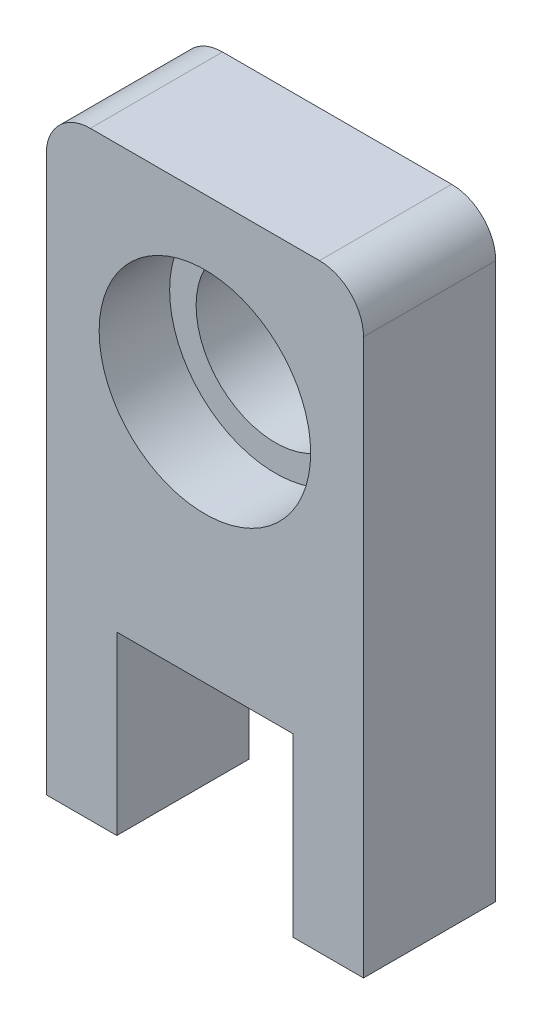
ISO-10303-21;
HEADER;
FILE_DESCRIPTION(('STEP AP214'),'2;1');
FILE_NAME('part.step','',(''),(''),'','','');
FILE_SCHEMA(('AUTOMOTIVE_DESIGN { 1 0 10303 214 1 1 1 1 }'));
ENDSEC;
DATA;
#1=APPLICATION_CONTEXT('core data for automotive mechanical design processes');
#2=APPLICATION_PROTOCOL_DEFINITION('international standard','automotive_design',2000,#1);
#3=PRODUCT_CONTEXT('',#1,'mechanical');
#4=PRODUCT('Part','Part','',(#3));
#5=PRODUCT_RELATED_PRODUCT_CATEGORY('part','',(#4));
#6=PRODUCT_DEFINITION_FORMATION('','',#4);
#7=PRODUCT_DEFINITION_CONTEXT('part definition',#1,'design');
#8=PRODUCT_DEFINITION('design','',#6,#7);
#9=PRODUCT_DEFINITION_SHAPE('','',#8);
#10=(LENGTH_UNIT() NAMED_UNIT(*) SI_UNIT(.MILLI.,.METRE.));
#11=(NAMED_UNIT(*) PLANE_ANGLE_UNIT() SI_UNIT($,.RADIAN.));
#12=(NAMED_UNIT(*) SI_UNIT($,.STERADIAN.) SOLID_ANGLE_UNIT());
#13=UNCERTAINTY_MEASURE_WITH_UNIT(LENGTH_MEASURE(1.E-05),#10,'distance_accuracy_value','');
#14=(GEOMETRIC_REPRESENTATION_CONTEXT(3) GLOBAL_UNCERTAINTY_ASSIGNED_CONTEXT((#13)) GLOBAL_UNIT_ASSIGNED_CONTEXT((#10,
#11,#12)) REPRESENTATION_CONTEXT('',''));
#15=CARTESIAN_POINT('',(0.,0.,0.));
#16=DIRECTION('',(0.,0.,1.));
#17=DIRECTION('',(1.,0.,0.));
#18=AXIS2_PLACEMENT_3D('',#15,#16,#17);
#19=CARTESIAN_POINT('',(10.,28.6,15.));
#20=DIRECTION('',(0.,0.,-1.));
#21=DIRECTION('',(-1.,0.,0.));
#22=AXIS2_PLACEMENT_3D('',#19,#20,#21);
#23=CYLINDRICAL_SURFACE('',#22,12.);
#24=CARTESIAN_POINT('',(10.,28.6,15.));
#25=DIRECTION('',(0.,0.,1.));
#26=DIRECTION('',(1.,0.,0.));
#27=AXIS2_PLACEMENT_3D('',#24,#25,#26);
#28=CIRCLE('',#27,12.);
#29=CARTESIAN_POINT('',(22.,28.6,15.));
#30=VERTEX_POINT('',#29);
#31=EDGE_CURVE('E186',#30,#30,#28,.T.);
#32=ORIENTED_EDGE('',*,*,#31,.T.);
#33=EDGE_LOOP('',(#32));
#34=FACE_BOUND('',#33,.T.);
#35=CARTESIAN_POINT('',(10.,28.6,7.));
#36=DIRECTION('',(0.,0.,-1.));
#37=DIRECTION('',(-1.,0.,0.));
#38=AXIS2_PLACEMENT_3D('',#35,#36,#37);
#39=CIRCLE('',#38,12.);
#40=CARTESIAN_POINT('',(-2.,28.6,7.));
#41=VERTEX_POINT('',#40);
#42=EDGE_CURVE('E159',#41,#41,#39,.T.);
#43=ORIENTED_EDGE('',*,*,#42,.T.);
#44=EDGE_LOOP('',(#43));
#45=FACE_BOUND('',#44,.T.);
#46=ADVANCED_FACE('F41',(#34,#45),#23,.F.);
#47=CARTESIAN_POINT('',(0.,48.,15.));
#48=DIRECTION('',(0.,-1.,0.));
#49=DIRECTION('',(0.,0.,-1.));
#50=AXIS2_PLACEMENT_3D('',#47,#48,#49);
#51=PLANE('',#50);
#52=DIRECTION('',(-1.,0.,0.));
#53=VECTOR('',#52,1.);
#54=CARTESIAN_POINT('',(0.,48.,0.));
#55=LINE('',#54,#53);
#56=CARTESIAN_POINT('',(23.,48.,0.));
#57=VERTEX_POINT('',#56);
#58=CARTESIAN_POINT('',(-2.99999999999999,48.,0.));
#59=VERTEX_POINT('',#58);
#60=EDGE_CURVE('E154',#57,#59,#55,.T.);
#61=ORIENTED_EDGE('',*,*,#60,.T.);
#62=DIRECTION('',(0.,0.,-1.));
#63=VECTOR('',#62,1.);
#64=CARTESIAN_POINT('',(-2.99999999999999,48.,15.));
#65=LINE('',#64,#63);
#66=CARTESIAN_POINT('',(-2.99999999999999,48.,15.));
#67=VERTEX_POINT('',#66);
#68=EDGE_CURVE('E11',#67,#59,#65,.T.);
#69=ORIENTED_EDGE('',*,*,#68,.F.);
#70=DIRECTION('',(-1.,0.,0.));
#71=VECTOR('',#70,1.);
#72=CARTESIAN_POINT('',(0.,48.,15.));
#73=LINE('',#72,#71);
#74=CARTESIAN_POINT('',(23.,48.,15.));
#75=VERTEX_POINT('',#74);
#76=EDGE_CURVE('E261',#75,#67,#73,.T.);
#77=ORIENTED_EDGE('',*,*,#76,.F.);
#78=DIRECTION('',(0.,0.,-1.));
#79=VECTOR('',#78,1.);
#80=CARTESIAN_POINT('',(23.,48.,15.));
#81=LINE('',#80,#79);
#82=EDGE_CURVE('E149',#75,#57,#81,.T.);
#83=ORIENTED_EDGE('',*,*,#82,.T.);
#84=EDGE_LOOP('',(#61,#69,#77,#83));
#85=FACE_BOUND('',#84,.T.);
#86=ADVANCED_FACE('F267',(#85),#51,.F.);
#87=CARTESIAN_POINT('',(-2.99999999999999,43.,15.));
#88=DIRECTION('',(0.,0.,-1.));
#89=DIRECTION('',(-1.,0.,0.));
#90=AXIS2_PLACEMENT_3D('',#87,#88,#89);
#91=CYLINDRICAL_SURFACE('',#90,5.);
#92=CARTESIAN_POINT('',(-2.99999999999999,43.,0.));
#93=DIRECTION('',(0.,0.,1.));
#94=DIRECTION('',(1.,0.,0.));
#95=AXIS2_PLACEMENT_3D('',#92,#93,#94);
#96=CIRCLE('',#95,5.);
#97=CARTESIAN_POINT('',(-7.99999999999999,43.,0.));
#98=VERTEX_POINT('',#97);
#99=EDGE_CURVE('E158',#59,#98,#96,.T.);
#100=ORIENTED_EDGE('',*,*,#99,.T.);
#101=DIRECTION('',(0.,0.,-1.));
#102=VECTOR('',#101,1.);
#103=CARTESIAN_POINT('',(-7.99999999999999,43.,15.));
#104=LINE('',#103,#102);
#105=CARTESIAN_POINT('',(-7.99999999999999,43.,15.));
#106=VERTEX_POINT('',#105);
#107=EDGE_CURVE('E50',#106,#98,#104,.T.);
#108=ORIENTED_EDGE('',*,*,#107,.F.);
#109=CARTESIAN_POINT('',(-2.99999999999999,43.,15.));
#110=DIRECTION('',(0.,0.,1.));
#111=DIRECTION('',(1.,0.,0.));
#112=AXIS2_PLACEMENT_3D('',#109,#110,#111);
#113=CIRCLE('',#112,5.);
#114=EDGE_CURVE('E103',#67,#106,#113,.T.);
#115=ORIENTED_EDGE('',*,*,#114,.F.);
#116=ORIENTED_EDGE('',*,*,#68,.T.);
#117=EDGE_LOOP('',(#100,#108,#115,#116));
#118=FACE_BOUND('',#117,.T.);
#119=ADVANCED_FACE('F268',(#118),#91,.T.);
#120=CARTESIAN_POINT('',(-7.99999999999999,0.,15.));
#121=DIRECTION('',(1.,0.,0.));
#122=DIRECTION('',(0.,1.,0.));
#123=AXIS2_PLACEMENT_3D('',#120,#121,#122);
#124=PLANE('',#123);
#125=DIRECTION('',(0.,-1.,0.));
#126=VECTOR('',#125,1.);
#127=CARTESIAN_POINT('',(-7.99999999999999,0.,0.));
#128=LINE('',#127,#126);
#129=CARTESIAN_POINT('',(-8.,-20.,0.));
#130=VERTEX_POINT('',#129);
#131=EDGE_CURVE('E162',#98,#130,#128,.T.);
#132=ORIENTED_EDGE('',*,*,#131,.T.);
#133=DIRECTION('',(0.,0.,-1.));
#134=VECTOR('',#133,1.);
#135=CARTESIAN_POINT('',(-8.,-20.,15.));
#136=LINE('',#135,#134);
#137=CARTESIAN_POINT('',(-8.,-20.,15.));
#138=VERTEX_POINT('',#137);
#139=EDGE_CURVE('E203',#138,#130,#136,.T.);
#140=ORIENTED_EDGE('',*,*,#139,.F.);
#141=DIRECTION('',(0.,-1.,0.));
#142=VECTOR('',#141,1.);
#143=CARTESIAN_POINT('',(-7.99999999999999,0.,15.));
#144=LINE('',#143,#142);
#145=EDGE_CURVE('E212',#106,#138,#144,.T.);
#146=ORIENTED_EDGE('',*,*,#145,.F.);
#147=ORIENTED_EDGE('',*,*,#107,.T.);
#148=EDGE_LOOP('',(#132,#140,#146,#147));
#149=FACE_BOUND('',#148,.T.);
#150=ADVANCED_FACE('F210',(#149),#124,.F.);
#151=CARTESIAN_POINT('',(0.,-20.,15.));
#152=DIRECTION('',(0.,-1.,0.));
#153=DIRECTION('',(0.,0.,-1.));
#154=AXIS2_PLACEMENT_3D('',#151,#152,#153);
#155=PLANE('',#154);
#156=DIRECTION('',(-1.,0.,0.));
#157=VECTOR('',#156,1.);
#158=CARTESIAN_POINT('',(0.,-20.,0.));
#159=LINE('',#158,#157);
#160=CARTESIAN_POINT('',(0.,-20.,0.));
#161=VERTEX_POINT('',#160);
#162=EDGE_CURVE('E166',#161,#130,#159,.T.);
#163=ORIENTED_EDGE('',*,*,#162,.F.);
#164=DIRECTION('',(0.,0.,-1.));
#165=VECTOR('',#164,1.);
#166=CARTESIAN_POINT('',(0.,-20.,15.));
#167=LINE('',#166,#165);
#168=CARTESIAN_POINT('',(0.,-20.,15.));
#169=VERTEX_POINT('',#168);
#170=EDGE_CURVE('E200',#169,#161,#167,.T.);
#171=ORIENTED_EDGE('',*,*,#170,.F.);
#172=DIRECTION('',(-1.,0.,0.));
#173=VECTOR('',#172,1.);
#174=CARTESIAN_POINT('',(0.,-20.,15.));
#175=LINE('',#174,#173);
#176=EDGE_CURVE('E144',#169,#138,#175,.T.);
#177=ORIENTED_EDGE('',*,*,#176,.T.);
#178=ORIENTED_EDGE('',*,*,#139,.T.);
#179=EDGE_LOOP('',(#163,#171,#177,#178));
#180=FACE_BOUND('',#179,.T.);
#181=ADVANCED_FACE('F221',(#180),#155,.T.);
#182=CARTESIAN_POINT('',(0.,0.,15.));
#183=DIRECTION('',(1.,0.,0.));
#184=DIRECTION('',(0.,0.,-1.));
#185=AXIS2_PLACEMENT_3D('',#182,#183,#184);
#186=PLANE('',#185);
#187=DIRECTION('',(0.,-1.,0.));
#188=VECTOR('',#187,1.);
#189=CARTESIAN_POINT('',(0.,0.,0.));
#190=LINE('',#189,#188);
#191=CARTESIAN_POINT('',(0.,0.,0.));
#192=VERTEX_POINT('',#191);
#193=EDGE_CURVE('E170',#192,#161,#190,.T.);
#194=ORIENTED_EDGE('',*,*,#193,.F.);
#195=DIRECTION('',(0.,0.,-1.));
#196=VECTOR('',#195,1.);
#197=CARTESIAN_POINT('',(0.,0.,15.));
#198=LINE('',#197,#196);
#199=CARTESIAN_POINT('',(0.,0.,15.));
#200=VERTEX_POINT('',#199);
#201=EDGE_CURVE('E197',#200,#192,#198,.T.);
#202=ORIENTED_EDGE('',*,*,#201,.F.);
#203=DIRECTION('',(0.,-1.,0.));
#204=VECTOR('',#203,1.);
#205=CARTESIAN_POINT('',(0.,0.,15.));
#206=LINE('',#205,#204);
#207=EDGE_CURVE('E227',#200,#169,#206,.T.);
#208=ORIENTED_EDGE('',*,*,#207,.T.);
#209=ORIENTED_EDGE('',*,*,#170,.T.);
#210=EDGE_LOOP('',(#194,#202,#208,#209));
#211=FACE_BOUND('',#210,.T.);
#212=ADVANCED_FACE('F311',(#211),#186,.T.);
#213=CARTESIAN_POINT('',(0.,0.,15.));
#214=DIRECTION('',(0.,1.,0.));
#215=DIRECTION('',(0.,0.,1.));
#216=AXIS2_PLACEMENT_3D('',#213,#214,#215);
#217=PLANE('',#216);
#218=DIRECTION('',(1.,0.,0.));
#219=VECTOR('',#218,1.);
#220=CARTESIAN_POINT('',(0.,0.,0.));
#221=LINE('',#220,#219);
#222=CARTESIAN_POINT('',(20.,0.,0.));
#223=VERTEX_POINT('',#222);
#224=EDGE_CURVE('E174',#192,#223,#221,.T.);
#225=ORIENTED_EDGE('',*,*,#224,.T.);
#226=DIRECTION('',(0.,0.,-1.));
#227=VECTOR('',#226,1.);
#228=CARTESIAN_POINT('',(20.,0.,15.));
#229=LINE('',#228,#227);
#230=CARTESIAN_POINT('',(20.,0.,15.));
#231=VERTEX_POINT('',#230);
#232=EDGE_CURVE('E193',#231,#223,#229,.T.);
#233=ORIENTED_EDGE('',*,*,#232,.F.);
#234=DIRECTION('',(1.,0.,0.));
#235=VECTOR('',#234,1.);
#236=CARTESIAN_POINT('',(0.,0.,15.));
#237=LINE('',#236,#235);
#238=EDGE_CURVE('E230',#200,#231,#237,.T.);
#239=ORIENTED_EDGE('',*,*,#238,.F.);
#240=ORIENTED_EDGE('',*,*,#201,.T.);
#241=EDGE_LOOP('',(#225,#233,#239,#240));
#242=FACE_BOUND('',#241,.T.);
#243=ADVANCED_FACE('F239',(#242),#217,.F.);
#244=CARTESIAN_POINT('',(20.,0.,15.));
#245=DIRECTION('',(1.,0.,0.));
#246=DIRECTION('',(0.,0.,-1.));
#247=AXIS2_PLACEMENT_3D('',#244,#245,#246);
#248=PLANE('',#247);
#249=DIRECTION('',(0.,-1.,0.));
#250=VECTOR('',#249,1.);
#251=CARTESIAN_POINT('',(20.,0.,0.));
#252=LINE('',#251,#250);
#253=CARTESIAN_POINT('',(20.,-20.,0.));
#254=VERTEX_POINT('',#253);
#255=EDGE_CURVE('E177',#223,#254,#252,.T.);
#256=ORIENTED_EDGE('',*,*,#255,.T.);
#257=DIRECTION('',(0.,0.,-1.));
#258=VECTOR('',#257,1.);
#259=CARTESIAN_POINT('',(20.,-20.,15.));
#260=LINE('',#259,#258);
#261=CARTESIAN_POINT('',(20.,-20.,15.));
#262=VERTEX_POINT('',#261);
#263=EDGE_CURVE('E135',#262,#254,#260,.T.);
#264=ORIENTED_EDGE('',*,*,#263,.F.);
#265=DIRECTION('',(0.,-1.,0.));
#266=VECTOR('',#265,1.);
#267=CARTESIAN_POINT('',(20.,0.,15.));
#268=LINE('',#267,#266);
#269=EDGE_CURVE('E140',#231,#262,#268,.T.);
#270=ORIENTED_EDGE('',*,*,#269,.F.);
#271=ORIENTED_EDGE('',*,*,#232,.T.);
#272=EDGE_LOOP('',(#256,#264,#270,#271));
#273=FACE_BOUND('',#272,.T.);
#274=ADVANCED_FACE('F242',(#273),#248,.F.);
#275=CARTESIAN_POINT('',(28.,-20.,0.));
#276=VERTEX_POINT('',#275);
#277=EDGE_CURVE('E129',#276,#254,#159,.T.);
#278=ORIENTED_EDGE('',*,*,#277,.F.);
#279=DIRECTION('',(0.,0.,-1.));
#280=VECTOR('',#279,1.);
#281=CARTESIAN_POINT('',(28.,-20.,15.));
#282=LINE('',#281,#280);
#283=CARTESIAN_POINT('',(28.,-20.,15.));
#284=VERTEX_POINT('',#283);
#285=EDGE_CURVE('E124',#284,#276,#282,.T.);
#286=ORIENTED_EDGE('',*,*,#285,.F.);
#287=EDGE_CURVE('E127',#284,#262,#175,.T.);
#288=ORIENTED_EDGE('',*,*,#287,.T.);
#289=ORIENTED_EDGE('',*,*,#263,.T.);
#290=EDGE_LOOP('',(#278,#286,#288,#289));
#291=FACE_BOUND('',#290,.T.);
#292=ADVANCED_FACE('F126',(#291),#155,.T.);
#293=CARTESIAN_POINT('',(28.,0.,15.));
#294=DIRECTION('',(1.,0.,0.));
#295=DIRECTION('',(0.,1.,0.));
#296=AXIS2_PLACEMENT_3D('',#293,#294,#295);
#297=PLANE('',#296);
#298=DIRECTION('',(0.,-1.,0.));
#299=VECTOR('',#298,1.);
#300=CARTESIAN_POINT('',(28.,0.,0.));
#301=LINE('',#300,#299);
#302=CARTESIAN_POINT('',(28.,43.,0.));
#303=VERTEX_POINT('',#302);
#304=EDGE_CURVE('E181',#303,#276,#301,.T.);
#305=ORIENTED_EDGE('',*,*,#304,.F.);
#306=DIRECTION('',(0.,0.,-1.));
#307=VECTOR('',#306,1.);
#308=CARTESIAN_POINT('',(28.,43.,15.));
#309=LINE('',#308,#307);
#310=CARTESIAN_POINT('',(28.,43.,15.));
#311=VERTEX_POINT('',#310);
#312=EDGE_CURVE('E92',#311,#303,#309,.T.);
#313=ORIENTED_EDGE('',*,*,#312,.F.);
#314=DIRECTION('',(0.,-1.,0.));
#315=VECTOR('',#314,1.);
#316=CARTESIAN_POINT('',(28.,0.,15.));
#317=LINE('',#316,#315);
#318=EDGE_CURVE('E138',#311,#284,#317,.T.);
#319=ORIENTED_EDGE('',*,*,#318,.T.);
#320=ORIENTED_EDGE('',*,*,#285,.T.);
#321=EDGE_LOOP('',(#305,#313,#319,#320));
#322=FACE_BOUND('',#321,.T.);
#323=ADVANCED_FACE('F145',(#322),#297,.T.);
#324=CARTESIAN_POINT('',(23.,43.,15.));
#325=DIRECTION('',(0.,0.,-1.));
#326=DIRECTION('',(-1.,0.,0.));
#327=AXIS2_PLACEMENT_3D('',#324,#325,#326);
#328=CYLINDRICAL_SURFACE('',#327,5.);
#329=CARTESIAN_POINT('',(23.,43.,0.));
#330=DIRECTION('',(0.,0.,1.));
#331=DIRECTION('',(1.,0.,0.));
#332=AXIS2_PLACEMENT_3D('',#329,#330,#331);
#333=CIRCLE('',#332,5.);
#334=EDGE_CURVE('E95',#303,#57,#333,.T.);
#335=ORIENTED_EDGE('',*,*,#334,.T.);
#336=ORIENTED_EDGE('',*,*,#82,.F.);
#337=CARTESIAN_POINT('',(23.,43.,15.));
#338=DIRECTION('',(0.,0.,1.));
#339=DIRECTION('',(1.,0.,0.));
#340=AXIS2_PLACEMENT_3D('',#337,#338,#339);
#341=CIRCLE('',#340,5.);
#342=EDGE_CURVE('E58',#311,#75,#341,.T.);
#343=ORIENTED_EDGE('',*,*,#342,.F.);
#344=ORIENTED_EDGE('',*,*,#312,.T.);
#345=EDGE_LOOP('',(#335,#336,#343,#344));
#346=FACE_BOUND('',#345,.T.);
#347=ADVANCED_FACE('F298',(#346),#328,.T.);
#348=CARTESIAN_POINT('',(0.,0.,15.));
#349=DIRECTION('',(0.,0.,1.));
#350=DIRECTION('',(1.,0.,0.));
#351=AXIS2_PLACEMENT_3D('',#348,#349,#350);
#352=PLANE('',#351);
#353=ORIENTED_EDGE('',*,*,#31,.F.);
#354=EDGE_LOOP('',(#353));
#355=FACE_BOUND('',#354,.T.);
#356=ORIENTED_EDGE('',*,*,#76,.T.);
#357=ORIENTED_EDGE('',*,*,#114,.T.);
#358=ORIENTED_EDGE('',*,*,#145,.T.);
#359=ORIENTED_EDGE('',*,*,#176,.F.);
#360=ORIENTED_EDGE('',*,*,#207,.F.);
#361=ORIENTED_EDGE('',*,*,#238,.T.);
#362=ORIENTED_EDGE('',*,*,#269,.T.);
#363=ORIENTED_EDGE('',*,*,#287,.F.);
#364=ORIENTED_EDGE('',*,*,#318,.F.);
#365=ORIENTED_EDGE('',*,*,#342,.T.);
#366=EDGE_LOOP('',(#356,#357,#358,#359,#360,#361,#362,#363,#364,#365));
#367=FACE_BOUND('',#366,.T.);
#368=ADVANCED_FACE('F137',(#355,#367),#352,.T.);
#369=CARTESIAN_POINT('',(0.,0.,0.));
#370=DIRECTION('',(0.,0.,1.));
#371=DIRECTION('',(1.,0.,0.));
#372=AXIS2_PLACEMENT_3D('',#369,#370,#371);
#373=PLANE('',#372);
#374=ORIENTED_EDGE('',*,*,#60,.F.);
#375=ORIENTED_EDGE('',*,*,#334,.F.);
#376=ORIENTED_EDGE('',*,*,#304,.T.);
#377=ORIENTED_EDGE('',*,*,#277,.T.);
#378=ORIENTED_EDGE('',*,*,#255,.F.);
#379=ORIENTED_EDGE('',*,*,#224,.F.);
#380=ORIENTED_EDGE('',*,*,#193,.T.);
#381=ORIENTED_EDGE('',*,*,#162,.T.);
#382=ORIENTED_EDGE('',*,*,#131,.F.);
#383=ORIENTED_EDGE('',*,*,#99,.F.);
#384=EDGE_LOOP('',(#374,#375,#376,#377,#378,#379,#380,#381,#382,#383));
#385=FACE_BOUND('',#384,.T.);
#386=CARTESIAN_POINT('',(10.,28.6,0.));
#387=DIRECTION('',(0.,0.,-1.));
#388=DIRECTION('',(-1.,0.,0.));
#389=AXIS2_PLACEMENT_3D('',#386,#387,#388);
#390=CIRCLE('',#389,9.);
#391=CARTESIAN_POINT('',(1.,28.6,0.));
#392=VERTEX_POINT('',#391);
#393=EDGE_CURVE('E251',#392,#392,#390,.T.);
#394=ORIENTED_EDGE('',*,*,#393,.F.);
#395=EDGE_LOOP('',(#394));
#396=FACE_BOUND('',#395,.T.);
#397=ADVANCED_FACE('F215',(#385,#396),#373,.F.);
#398=CARTESIAN_POINT('',(10.,28.6,7.));
#399=DIRECTION('',(0.,0.,-1.));
#400=DIRECTION('',(-1.,0.,0.));
#401=AXIS2_PLACEMENT_3D('',#398,#399,#400);
#402=PLANE('',#401);
#403=CARTESIAN_POINT('',(10.,28.6,7.));
#404=DIRECTION('',(0.,0.,-1.));
#405=DIRECTION('',(-1.,0.,0.));
#406=AXIS2_PLACEMENT_3D('',#403,#404,#405);
#407=CIRCLE('',#406,9.);
#408=CARTESIAN_POINT('',(1.,28.6,7.));
#409=VERTEX_POINT('',#408);
#410=EDGE_CURVE('E247',#409,#409,#407,.T.);
#411=ORIENTED_EDGE('',*,*,#410,.T.);
#412=EDGE_LOOP('',(#411));
#413=FACE_BOUND('',#412,.T.);
#414=ORIENTED_EDGE('',*,*,#42,.F.);
#415=EDGE_LOOP('',(#414));
#416=FACE_BOUND('',#415,.T.);
#417=ADVANCED_FACE('F284',(#413,#416),#402,.F.);
#418=CARTESIAN_POINT('',(10.,28.6,7.));
#419=DIRECTION('',(0.,0.,-1.));
#420=DIRECTION('',(-1.,0.,0.));
#421=AXIS2_PLACEMENT_3D('',#418,#419,#420);
#422=CYLINDRICAL_SURFACE('',#421,9.);
#423=ORIENTED_EDGE('',*,*,#410,.F.);
#424=EDGE_LOOP('',(#423));
#425=FACE_BOUND('',#424,.T.);
#426=ORIENTED_EDGE('',*,*,#393,.T.);
#427=EDGE_LOOP('',(#426));
#428=FACE_BOUND('',#427,.T.);
#429=ADVANCED_FACE('F286',(#425,#428),#422,.F.);
#430=CLOSED_SHELL('',(#46,#86,#119,#150,#181,#212,#243,#274,#292,#323,#347,#368,#397,#417,#429));
#431=MANIFOLD_SOLID_BREP('B2',#430);
#432=ADVANCED_BREP_SHAPE_REPRESENTATION('',(#18,#431),#14);
#433=SHAPE_DEFINITION_REPRESENTATION(#9,#432);
ENDSEC;
END-ISO-10303-21;
